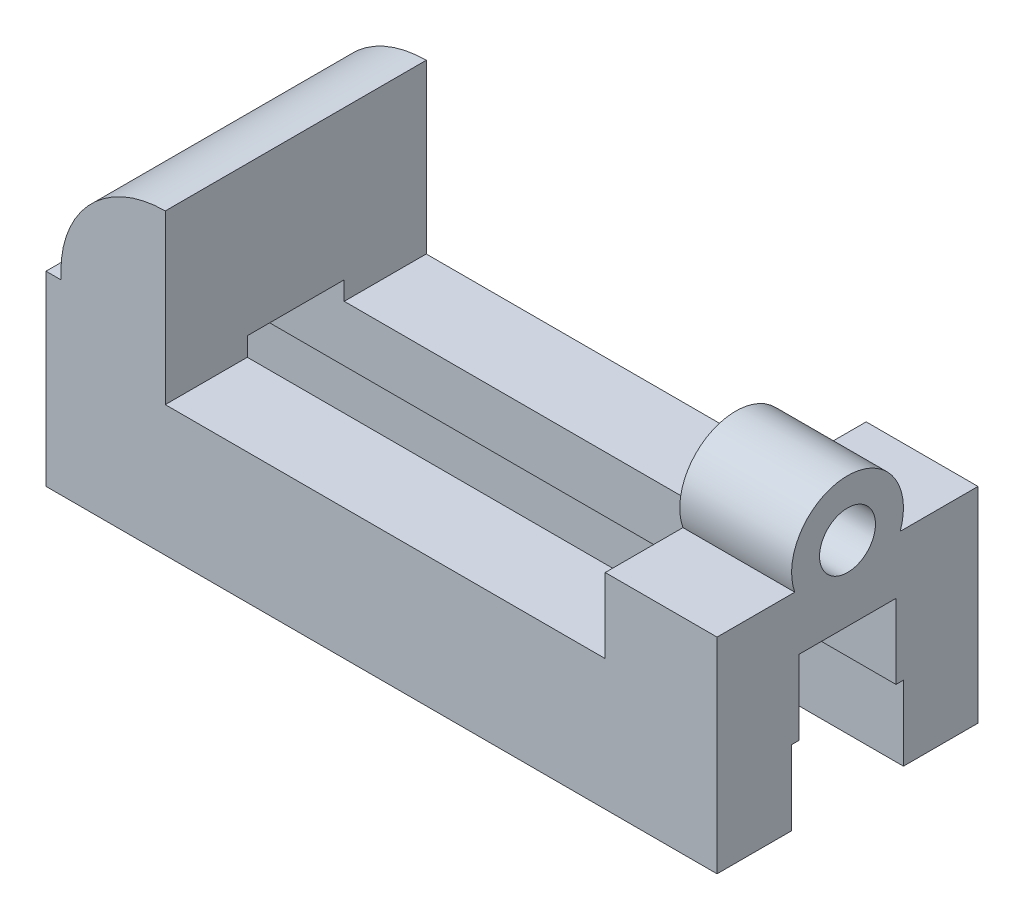
ISO-10303-21;
HEADER;
FILE_DESCRIPTION(('STEP AP214'),'2;1');
FILE_NAME('part.step','',(''),(''),'','','');
FILE_SCHEMA(('AUTOMOTIVE_DESIGN { 1 0 10303 214 1 1 1 1 }'));
ENDSEC;
DATA;
#1=APPLICATION_CONTEXT('core data for automotive mechanical design processes');
#2=APPLICATION_PROTOCOL_DEFINITION('international standard','automotive_design',2000,#1);
#3=PRODUCT_CONTEXT('',#1,'mechanical');
#4=PRODUCT('Part','Part','',(#3));
#5=PRODUCT_RELATED_PRODUCT_CATEGORY('part','',(#4));
#6=PRODUCT_DEFINITION_FORMATION('','',#4);
#7=PRODUCT_DEFINITION_CONTEXT('part definition',#1,'design');
#8=PRODUCT_DEFINITION('design','',#6,#7);
#9=PRODUCT_DEFINITION_SHAPE('','',#8);
#10=(LENGTH_UNIT() NAMED_UNIT(*) SI_UNIT(.MILLI.,.METRE.));
#11=(NAMED_UNIT(*) PLANE_ANGLE_UNIT() SI_UNIT($,.RADIAN.));
#12=(NAMED_UNIT(*) SI_UNIT($,.STERADIAN.) SOLID_ANGLE_UNIT());
#13=UNCERTAINTY_MEASURE_WITH_UNIT(LENGTH_MEASURE(1.E-05),#10,'distance_accuracy_value','');
#14=(GEOMETRIC_REPRESENTATION_CONTEXT(3) GLOBAL_UNCERTAINTY_ASSIGNED_CONTEXT((#13)) GLOBAL_UNIT_ASSIGNED_CONTEXT((#10,
#11,#12)) REPRESENTATION_CONTEXT('',''));
#15=CARTESIAN_POINT('',(0.,0.,0.));
#16=DIRECTION('',(0.,0.,1.));
#17=DIRECTION('',(1.,0.,0.));
#18=AXIS2_PLACEMENT_3D('',#15,#16,#17);
#19=CARTESIAN_POINT('',(180.,55.,-70.));
#20=DIRECTION('',(0.,1.,0.));
#21=DIRECTION('',(0.,0.,1.));
#22=AXIS2_PLACEMENT_3D('',#19,#20,#21);
#23=PLANE('',#22);
#24=DIRECTION('',(0.,0.,1.));
#25=VECTOR('',#24,1.);
#26=CARTESIAN_POINT('',(180.,55.,-70.));
#27=LINE('',#26,#25);
#28=CARTESIAN_POINT('',(180.,55.,-20.8578643762691));
#29=VERTEX_POINT('',#28);
#30=CARTESIAN_POINT('',(180.,55.,0.));
#31=VERTEX_POINT('',#30);
#32=EDGE_CURVE('E235',#29,#31,#27,.T.);
#33=ORIENTED_EDGE('',*,*,#32,.F.);
#34=DIRECTION('',(1.,0.,0.));
#35=VECTOR('',#34,1.);
#36=CARTESIAN_POINT('',(150.,55.,-20.8578643762691));
#37=LINE('',#36,#35);
#38=CARTESIAN_POINT('',(150.,55.,-20.8578643762691));
#39=VERTEX_POINT('',#38);
#40=EDGE_CURVE('E210',#29,#39,#37,.F.);
#41=ORIENTED_EDGE('',*,*,#40,.T.);
#42=DIRECTION('',(0.,0.,1.));
#43=VECTOR('',#42,1.);
#44=CARTESIAN_POINT('',(150.,55.,-70.));
#45=LINE('',#44,#43);
#46=CARTESIAN_POINT('',(150.,55.,0.));
#47=VERTEX_POINT('',#46);
#48=EDGE_CURVE('E220',#39,#47,#45,.T.);
#49=ORIENTED_EDGE('',*,*,#48,.T.);
#50=DIRECTION('',(-1.,0.,0.));
#51=VECTOR('',#50,1.);
#52=CARTESIAN_POINT('',(180.,55.,0.));
#53=LINE('',#52,#51);
#54=EDGE_CURVE('E356',#31,#47,#53,.T.);
#55=ORIENTED_EDGE('',*,*,#54,.F.);
#56=EDGE_LOOP('',(#33,#41,#49,#55));
#57=FACE_BOUND('',#56,.T.);
#58=ADVANCED_FACE('F38',(#57),#23,.T.);
#59=CARTESIAN_POINT('',(150.,55.,-70.));
#60=VERTEX_POINT('',#59);
#61=CARTESIAN_POINT('',(150.,55.,-49.1421356237309));
#62=VERTEX_POINT('',#61);
#63=EDGE_CURVE('E217',#60,#62,#45,.T.);
#64=ORIENTED_EDGE('',*,*,#63,.T.);
#65=DIRECTION('',(1.,0.,0.));
#66=VECTOR('',#65,1.);
#67=CARTESIAN_POINT('',(150.,55.,-49.1421356237309));
#68=LINE('',#67,#66);
#69=CARTESIAN_POINT('',(180.,55.,-49.1421356237309));
#70=VERTEX_POINT('',#69);
#71=EDGE_CURVE('E203',#62,#70,#68,.T.);
#72=ORIENTED_EDGE('',*,*,#71,.T.);
#73=CARTESIAN_POINT('',(180.,55.,-70.));
#74=VERTEX_POINT('',#73);
#75=EDGE_CURVE('E231',#74,#70,#27,.T.);
#76=ORIENTED_EDGE('',*,*,#75,.F.);
#77=DIRECTION('',(-1.,0.,0.));
#78=VECTOR('',#77,1.);
#79=CARTESIAN_POINT('',(180.,55.,-70.));
#80=LINE('',#79,#78);
#81=EDGE_CURVE('E226',#74,#60,#80,.T.);
#82=ORIENTED_EDGE('',*,*,#81,.T.);
#83=EDGE_LOOP('',(#64,#72,#76,#82));
#84=FACE_BOUND('',#83,.T.);
#85=ADVANCED_FACE('F224',(#84),#23,.T.);
#86=CARTESIAN_POINT('',(150.,35.,-70.));
#87=DIRECTION('',(0.,1.,0.));
#88=DIRECTION('',(-1.,0.,0.));
#89=AXIS2_PLACEMENT_3D('',#86,#87,#88);
#90=PLANE('',#89);
#91=DIRECTION('',(-1.,0.,0.));
#92=VECTOR('',#91,1.);
#93=CARTESIAN_POINT('',(150.,35.,-48.));
#94=LINE('',#93,#92);
#95=CARTESIAN_POINT('',(150.,35.,-48.));
#96=VERTEX_POINT('',#95);
#97=CARTESIAN_POINT('',(32.,35.,-48.));
#98=VERTEX_POINT('',#97);
#99=EDGE_CURVE('E312',#96,#98,#94,.T.);
#100=ORIENTED_EDGE('',*,*,#99,.F.);
#101=DIRECTION('',(0.,0.,1.));
#102=VECTOR('',#101,1.);
#103=CARTESIAN_POINT('',(150.,35.,-70.));
#104=LINE('',#103,#102);
#105=CARTESIAN_POINT('',(150.,35.,-70.));
#106=VERTEX_POINT('',#105);
#107=EDGE_CURVE('E229',#106,#96,#104,.T.);
#108=ORIENTED_EDGE('',*,*,#107,.F.);
#109=DIRECTION('',(-1.,0.,0.));
#110=VECTOR('',#109,1.);
#111=CARTESIAN_POINT('',(150.,35.,-70.));
#112=LINE('',#111,#110);
#113=CARTESIAN_POINT('',(32.,35.,-70.));
#114=VERTEX_POINT('',#113);
#115=EDGE_CURVE('E330',#106,#114,#112,.T.);
#116=ORIENTED_EDGE('',*,*,#115,.T.);
#117=DIRECTION('',(0.,0.,1.));
#118=VECTOR('',#117,1.);
#119=CARTESIAN_POINT('',(32.,35.,-70.));
#120=LINE('',#119,#118);
#121=EDGE_CURVE('E387',#114,#98,#120,.T.);
#122=ORIENTED_EDGE('',*,*,#121,.T.);
#123=EDGE_LOOP('',(#100,#108,#116,#122));
#124=FACE_BOUND('',#123,.T.);
#125=ADVANCED_FACE('F398',(#124),#90,.T.);
#126=CARTESIAN_POINT('',(0.,0.,-70.));
#127=DIRECTION('',(0.,-1.,0.));
#128=DIRECTION('',(0.,0.,-1.));
#129=AXIS2_PLACEMENT_3D('',#126,#127,#128);
#130=PLANE('',#129);
#131=DIRECTION('',(1.,0.,0.));
#132=VECTOR('',#131,1.);
#133=CARTESIAN_POINT('',(0.,0.,-50.));
#134=LINE('',#133,#132);
#135=CARTESIAN_POINT('',(0.,0.,-50.));
#136=VERTEX_POINT('',#135);
#137=CARTESIAN_POINT('',(180.,0.,-50.));
#138=VERTEX_POINT('',#137);
#139=EDGE_CURVE('E246',#136,#138,#134,.T.);
#140=ORIENTED_EDGE('',*,*,#139,.F.);
#141=DIRECTION('',(0.,0.,1.));
#142=VECTOR('',#141,1.);
#143=CARTESIAN_POINT('',(0.,0.,-70.));
#144=LINE('',#143,#142);
#145=CARTESIAN_POINT('',(0.,0.,-70.));
#146=VERTEX_POINT('',#145);
#147=EDGE_CURVE('E240',#146,#136,#144,.T.);
#148=ORIENTED_EDGE('',*,*,#147,.F.);
#149=DIRECTION('',(1.,0.,0.));
#150=VECTOR('',#149,1.);
#151=CARTESIAN_POINT('',(0.,0.,-70.));
#152=LINE('',#151,#150);
#153=CARTESIAN_POINT('',(180.,0.,-70.));
#154=VERTEX_POINT('',#153);
#155=EDGE_CURVE('E320',#146,#154,#152,.T.);
#156=ORIENTED_EDGE('',*,*,#155,.T.);
#157=DIRECTION('',(0.,0.,1.));
#158=VECTOR('',#157,1.);
#159=CARTESIAN_POINT('',(180.,0.,-70.));
#160=LINE('',#159,#158);
#161=EDGE_CURVE('E236',#154,#138,#160,.T.);
#162=ORIENTED_EDGE('',*,*,#161,.T.);
#163=EDGE_LOOP('',(#140,#148,#156,#162));
#164=FACE_BOUND('',#163,.T.);
#165=ADVANCED_FACE('F464',(#164),#130,.T.);
#166=CARTESIAN_POINT('',(0.,50.,-70.));
#167=DIRECTION('',(-1.,0.,0.));
#168=DIRECTION('',(0.,0.,1.));
#169=AXIS2_PLACEMENT_3D('',#166,#167,#168);
#170=PLANE('',#169);
#171=DIRECTION('',(0.,-1.,0.));
#172=VECTOR('',#171,1.);
#173=CARTESIAN_POINT('',(0.,0.,-50.));
#174=LINE('',#173,#172);
#175=CARTESIAN_POINT('',(0.,20.,-50.));
#176=VERTEX_POINT('',#175);
#177=EDGE_CURVE('E294',#176,#136,#174,.T.);
#178=ORIENTED_EDGE('',*,*,#177,.F.);
#179=DIRECTION('',(0.,0.,-1.));
#180=VECTOR('',#179,1.);
#181=CARTESIAN_POINT('',(0.,20.,-50.));
#182=LINE('',#181,#180);
#183=CARTESIAN_POINT('',(0.,20.,-48.));
#184=VERTEX_POINT('',#183);
#185=EDGE_CURVE('E423',#184,#176,#182,.T.);
#186=ORIENTED_EDGE('',*,*,#185,.F.);
#187=DIRECTION('',(0.,-1.,0.));
#188=VECTOR('',#187,1.);
#189=CARTESIAN_POINT('',(0.,20.,-48.));
#190=LINE('',#189,#188);
#191=CARTESIAN_POINT('',(0.,40.,-48.));
#192=VERTEX_POINT('',#191);
#193=EDGE_CURVE('E426',#192,#184,#190,.T.);
#194=ORIENTED_EDGE('',*,*,#193,.F.);
#195=DIRECTION('',(0.,0.,-1.));
#196=VECTOR('',#195,1.);
#197=CARTESIAN_POINT('',(0.,40.,-48.));
#198=LINE('',#197,#196);
#199=CARTESIAN_POINT('',(0.,40.,-22.));
#200=VERTEX_POINT('',#199);
#201=EDGE_CURVE('E417',#200,#192,#198,.T.);
#202=ORIENTED_EDGE('',*,*,#201,.F.);
#203=DIRECTION('',(0.,1.,0.));
#204=VECTOR('',#203,1.);
#205=CARTESIAN_POINT('',(0.,40.,-22.));
#206=LINE('',#205,#204);
#207=CARTESIAN_POINT('',(0.,20.,-22.));
#208=VERTEX_POINT('',#207);
#209=EDGE_CURVE('E429',#208,#200,#206,.T.);
#210=ORIENTED_EDGE('',*,*,#209,.F.);
#211=DIRECTION('',(0.,0.,-1.));
#212=VECTOR('',#211,1.);
#213=CARTESIAN_POINT('',(0.,20.,-22.));
#214=LINE('',#213,#212);
#215=CARTESIAN_POINT('',(0.,20.,-20.));
#216=VERTEX_POINT('',#215);
#217=EDGE_CURVE('E288',#216,#208,#214,.T.);
#218=ORIENTED_EDGE('',*,*,#217,.F.);
#219=DIRECTION('',(0.,1.,0.));
#220=VECTOR('',#219,1.);
#221=CARTESIAN_POINT('',(0.,20.,-20.));
#222=LINE('',#221,#220);
#223=CARTESIAN_POINT('',(0.,0.,-20.));
#224=VERTEX_POINT('',#223);
#225=EDGE_CURVE('E432',#224,#216,#222,.T.);
#226=ORIENTED_EDGE('',*,*,#225,.F.);
#227=CARTESIAN_POINT('',(0.,0.,0.));
#228=VERTEX_POINT('',#227);
#229=EDGE_CURVE('E243',#224,#228,#144,.T.);
#230=ORIENTED_EDGE('',*,*,#229,.T.);
#231=DIRECTION('',(0.,-1.,0.));
#232=VECTOR('',#231,1.);
#233=CARTESIAN_POINT('',(0.,50.,0.));
#234=LINE('',#233,#232);
#235=CARTESIAN_POINT('',(0.,50.,0.));
#236=VERTEX_POINT('',#235);
#237=EDGE_CURVE('E316',#236,#228,#234,.T.);
#238=ORIENTED_EDGE('',*,*,#237,.F.);
#239=DIRECTION('',(0.,0.,1.));
#240=VECTOR('',#239,1.);
#241=CARTESIAN_POINT('',(0.,50.,-70.));
#242=LINE('',#241,#240);
#243=CARTESIAN_POINT('',(0.,50.,-70.));
#244=VERTEX_POINT('',#243);
#245=EDGE_CURVE('E247',#244,#236,#242,.T.);
#246=ORIENTED_EDGE('',*,*,#245,.F.);
#247=DIRECTION('',(0.,-1.,0.));
#248=VECTOR('',#247,1.);
#249=CARTESIAN_POINT('',(0.,50.,-70.));
#250=LINE('',#249,#248);
#251=EDGE_CURVE('E317',#244,#146,#250,.T.);
#252=ORIENTED_EDGE('',*,*,#251,.T.);
#253=ORIENTED_EDGE('',*,*,#147,.T.);
#254=EDGE_LOOP('',(#178,#186,#194,#202,#210,#218,#226,#230,#238,#246,#252,#253));
#255=FACE_BOUND('',#254,.T.);
#256=ADVANCED_FACE('F40',(#255),#170,.T.);
#257=CARTESIAN_POINT('',(4.,50.,-70.));
#258=DIRECTION('',(0.,1.,0.));
#259=DIRECTION('',(-1.,0.,0.));
#260=AXIS2_PLACEMENT_3D('',#257,#258,#259);
#261=PLANE('',#260);
#262=DIRECTION('',(-1.,0.,0.));
#263=VECTOR('',#262,1.);
#264=CARTESIAN_POINT('',(4.,50.,0.));
#265=LINE('',#264,#263);
#266=CARTESIAN_POINT('',(4.,50.,0.));
#267=VERTEX_POINT('',#266);
#268=EDGE_CURVE('E321',#267,#236,#265,.T.);
#269=ORIENTED_EDGE('',*,*,#268,.F.);
#270=DIRECTION('',(0.,0.,1.));
#271=VECTOR('',#270,1.);
#272=CARTESIAN_POINT('',(4.,50.,-70.));
#273=LINE('',#272,#271);
#274=CARTESIAN_POINT('',(4.,50.,-70.));
#275=VERTEX_POINT('',#274);
#276=EDGE_CURVE('E380',#275,#267,#273,.T.);
#277=ORIENTED_EDGE('',*,*,#276,.F.);
#278=DIRECTION('',(-1.,0.,0.));
#279=VECTOR('',#278,1.);
#280=CARTESIAN_POINT('',(4.,50.,-70.));
#281=LINE('',#280,#279);
#282=EDGE_CURVE('E345',#275,#244,#281,.T.);
#283=ORIENTED_EDGE('',*,*,#282,.T.);
#284=ORIENTED_EDGE('',*,*,#245,.T.);
#285=EDGE_LOOP('',(#269,#277,#283,#284));
#286=FACE_BOUND('',#285,.T.);
#287=ADVANCED_FACE('F477',(#286),#261,.T.);
#288=CARTESIAN_POINT('',(4.,52.0000999999998,-70.));
#289=DIRECTION('',(-1.,0.,0.));
#290=DIRECTION('',(0.,-1.,0.));
#291=AXIS2_PLACEMENT_3D('',#288,#289,#290);
#292=PLANE('',#291);
#293=DIRECTION('',(0.,-1.,0.));
#294=VECTOR('',#293,1.);
#295=CARTESIAN_POINT('',(4.,52.0000999999998,0.));
#296=LINE('',#295,#294);
#297=CARTESIAN_POINT('',(4.,52.0000999999998,0.));
#298=VERTEX_POINT('',#297);
#299=EDGE_CURVE('E374',#298,#267,#296,.T.);
#300=ORIENTED_EDGE('',*,*,#299,.F.);
#301=DIRECTION('',(0.,0.,1.));
#302=VECTOR('',#301,1.);
#303=CARTESIAN_POINT('',(4.,52.0000999999998,-70.));
#304=LINE('',#303,#302);
#305=CARTESIAN_POINT('',(4.,52.0000999999998,-70.));
#306=VERTEX_POINT('',#305);
#307=EDGE_CURVE('E382',#306,#298,#304,.T.);
#308=ORIENTED_EDGE('',*,*,#307,.F.);
#309=DIRECTION('',(0.,-1.,0.));
#310=VECTOR('',#309,1.);
#311=CARTESIAN_POINT('',(4.,52.0000999999998,-70.));
#312=LINE('',#311,#310);
#313=EDGE_CURVE('E342',#306,#275,#312,.T.);
#314=ORIENTED_EDGE('',*,*,#313,.T.);
#315=ORIENTED_EDGE('',*,*,#276,.T.);
#316=EDGE_LOOP('',(#300,#308,#314,#315));
#317=FACE_BOUND('',#316,.T.);
#318=ADVANCED_FACE('F493',(#317),#292,.T.);
#319=CARTESIAN_POINT('',(31.9999,52.0001,-70.));
#320=DIRECTION('',(0.,0.,1.));
#321=DIRECTION('',(1.,0.,0.));
#322=AXIS2_PLACEMENT_3D('',#319,#320,#321);
#323=CYLINDRICAL_SURFACE('',#322,27.9999);
#324=CARTESIAN_POINT('',(31.9999,52.0001,0.));
#325=DIRECTION('',(0.,0.,1.));
#326=DIRECTION('',(1.,0.,0.));
#327=AXIS2_PLACEMENT_3D('',#324,#325,#326);
#328=CIRCLE('',#327,27.9999);
#329=CARTESIAN_POINT('',(31.9999000000002,80.,0.));
#330=VERTEX_POINT('',#329);
#331=EDGE_CURVE('E371',#330,#298,#328,.T.);
#332=ORIENTED_EDGE('',*,*,#331,.F.);
#333=DIRECTION('',(0.,0.,1.));
#334=VECTOR('',#333,1.);
#335=CARTESIAN_POINT('',(31.9999000000002,80.,-70.));
#336=LINE('',#335,#334);
#337=CARTESIAN_POINT('',(31.9999000000002,80.,-70.));
#338=VERTEX_POINT('',#337);
#339=EDGE_CURVE('E384',#338,#330,#336,.T.);
#340=ORIENTED_EDGE('',*,*,#339,.F.);
#341=CARTESIAN_POINT('',(31.9999,52.0001,-70.));
#342=DIRECTION('',(0.,0.,1.));
#343=DIRECTION('',(1.,0.,0.));
#344=AXIS2_PLACEMENT_3D('',#341,#342,#343);
#345=CIRCLE('',#344,27.9999);
#346=EDGE_CURVE('E339',#338,#306,#345,.T.);
#347=ORIENTED_EDGE('',*,*,#346,.T.);
#348=ORIENTED_EDGE('',*,*,#307,.T.);
#349=EDGE_LOOP('',(#332,#340,#347,#348));
#350=FACE_BOUND('',#349,.T.);
#351=ADVANCED_FACE('F496',(#350),#323,.T.);
#352=CARTESIAN_POINT('',(32.,80.,-70.));
#353=DIRECTION('',(0.,1.,0.));
#354=DIRECTION('',(0.,0.,1.));
#355=AXIS2_PLACEMENT_3D('',#352,#353,#354);
#356=PLANE('',#355);
#357=DIRECTION('',(-1.,0.,0.));
#358=VECTOR('',#357,1.);
#359=CARTESIAN_POINT('',(32.,80.,0.));
#360=LINE('',#359,#358);
#361=CARTESIAN_POINT('',(32.,80.,0.));
#362=VERTEX_POINT('',#361);
#363=EDGE_CURVE('E368',#362,#330,#360,.T.);
#364=ORIENTED_EDGE('',*,*,#363,.F.);
#365=DIRECTION('',(0.,0.,1.));
#366=VECTOR('',#365,1.);
#367=CARTESIAN_POINT('',(32.,80.,-70.));
#368=LINE('',#367,#366);
#369=CARTESIAN_POINT('',(32.,80.,-70.));
#370=VERTEX_POINT('',#369);
#371=EDGE_CURVE('E386',#370,#362,#368,.T.);
#372=ORIENTED_EDGE('',*,*,#371,.F.);
#373=DIRECTION('',(-1.,0.,0.));
#374=VECTOR('',#373,1.);
#375=CARTESIAN_POINT('',(32.,80.,-70.));
#376=LINE('',#375,#374);
#377=EDGE_CURVE('E336',#370,#338,#376,.T.);
#378=ORIENTED_EDGE('',*,*,#377,.T.);
#379=ORIENTED_EDGE('',*,*,#339,.T.);
#380=EDGE_LOOP('',(#364,#372,#378,#379));
#381=FACE_BOUND('',#380,.T.);
#382=ADVANCED_FACE('F498',(#381),#356,.T.);
#383=CARTESIAN_POINT('',(32.,35.,-70.));
#384=DIRECTION('',(1.,0.,0.));
#385=DIRECTION('',(0.,0.,-1.));
#386=AXIS2_PLACEMENT_3D('',#383,#384,#385);
#387=PLANE('',#386);
#388=DIRECTION('',(0.,1.,0.));
#389=VECTOR('',#388,1.);
#390=CARTESIAN_POINT('',(32.,35.,-48.));
#391=LINE('',#390,#389);
#392=CARTESIAN_POINT('',(32.,40.,-48.));
#393=VERTEX_POINT('',#392);
#394=EDGE_CURVE('E314',#98,#393,#391,.T.);
#395=ORIENTED_EDGE('',*,*,#394,.F.);
#396=ORIENTED_EDGE('',*,*,#121,.F.);
#397=DIRECTION('',(0.,1.,0.));
#398=VECTOR('',#397,1.);
#399=CARTESIAN_POINT('',(32.,35.,-70.));
#400=LINE('',#399,#398);
#401=EDGE_CURVE('E333',#114,#370,#400,.T.);
#402=ORIENTED_EDGE('',*,*,#401,.T.);
#403=ORIENTED_EDGE('',*,*,#371,.T.);
#404=DIRECTION('',(0.,1.,0.));
#405=VECTOR('',#404,1.);
#406=CARTESIAN_POINT('',(32.,35.,0.));
#407=LINE('',#406,#405);
#408=CARTESIAN_POINT('',(32.,35.,0.));
#409=VERTEX_POINT('',#408);
#410=EDGE_CURVE('E365',#409,#362,#407,.T.);
#411=ORIENTED_EDGE('',*,*,#410,.F.);
#412=CARTESIAN_POINT('',(32.,35.,-22.));
#413=VERTEX_POINT('',#412);
#414=EDGE_CURVE('E389',#413,#409,#120,.T.);
#415=ORIENTED_EDGE('',*,*,#414,.F.);
#416=DIRECTION('',(0.,-1.,0.));
#417=VECTOR('',#416,1.);
#418=CARTESIAN_POINT('',(32.,35.,-22.));
#419=LINE('',#418,#417);
#420=CARTESIAN_POINT('',(32.,40.,-22.));
#421=VERTEX_POINT('',#420);
#422=EDGE_CURVE('E305',#421,#413,#419,.T.);
#423=ORIENTED_EDGE('',*,*,#422,.F.);
#424=DIRECTION('',(0.,0.,1.));
#425=VECTOR('',#424,1.);
#426=CARTESIAN_POINT('',(32.,40.,-70.));
#427=LINE('',#426,#425);
#428=EDGE_CURVE('E308',#393,#421,#427,.T.);
#429=ORIENTED_EDGE('',*,*,#428,.F.);
#430=EDGE_LOOP('',(#395,#396,#402,#403,#411,#415,#423,#429));
#431=FACE_BOUND('',#430,.T.);
#432=ADVANCED_FACE('F407',(#431),#387,.T.);
#433=DIRECTION('',(1.,0.,0.));
#434=VECTOR('',#433,1.);
#435=CARTESIAN_POINT('',(150.,35.,-22.));
#436=LINE('',#435,#434);
#437=CARTESIAN_POINT('',(150.,35.,-22.));
#438=VERTEX_POINT('',#437);
#439=EDGE_CURVE('E61',#413,#438,#436,.T.);
#440=ORIENTED_EDGE('',*,*,#439,.F.);
#441=ORIENTED_EDGE('',*,*,#414,.T.);
#442=DIRECTION('',(-1.,0.,0.));
#443=VECTOR('',#442,1.);
#444=CARTESIAN_POINT('',(150.,35.,0.));
#445=LINE('',#444,#443);
#446=CARTESIAN_POINT('',(150.,35.,0.));
#447=VERTEX_POINT('',#446);
#448=EDGE_CURVE('E362',#447,#409,#445,.T.);
#449=ORIENTED_EDGE('',*,*,#448,.F.);
#450=EDGE_CURVE('E227',#438,#447,#104,.T.);
#451=ORIENTED_EDGE('',*,*,#450,.F.);
#452=EDGE_LOOP('',(#440,#441,#449,#451));
#453=FACE_BOUND('',#452,.T.);
#454=ADVANCED_FACE('F445',(#453),#90,.T.);
#455=CARTESIAN_POINT('',(150.,55.,-70.));
#456=DIRECTION('',(-1.,0.,0.));
#457=DIRECTION('',(0.,0.,1.));
#458=AXIS2_PLACEMENT_3D('',#455,#456,#457);
#459=PLANE('',#458);
#460=ORIENTED_EDGE('',*,*,#48,.F.);
#461=CARTESIAN_POINT('',(150.,60.,-35.));
#462=DIRECTION('',(-1.,0.,0.));
#463=DIRECTION('',(0.,0.,1.));
#464=AXIS2_PLACEMENT_3D('',#461,#462,#463);
#465=CIRCLE('',#464,15.);
#466=EDGE_CURVE('E206',#39,#62,#465,.T.);
#467=ORIENTED_EDGE('',*,*,#466,.T.);
#468=ORIENTED_EDGE('',*,*,#63,.F.);
#469=DIRECTION('',(0.,-1.,0.));
#470=VECTOR('',#469,1.);
#471=CARTESIAN_POINT('',(150.,55.,-70.));
#472=LINE('',#471,#470);
#473=EDGE_CURVE('E328',#60,#106,#472,.T.);
#474=ORIENTED_EDGE('',*,*,#473,.T.);
#475=ORIENTED_EDGE('',*,*,#107,.T.);
#476=DIRECTION('',(0.,-1.,0.));
#477=VECTOR('',#476,1.);
#478=CARTESIAN_POINT('',(150.,55.,-48.));
#479=LINE('',#478,#477);
#480=CARTESIAN_POINT('',(150.,40.,-48.));
#481=VERTEX_POINT('',#480);
#482=EDGE_CURVE('E310',#481,#96,#479,.T.);
#483=ORIENTED_EDGE('',*,*,#482,.F.);
#484=DIRECTION('',(0.,0.,-1.));
#485=VECTOR('',#484,1.);
#486=CARTESIAN_POINT('',(150.,40.,-70.));
#487=LINE('',#486,#485);
#488=CARTESIAN_POINT('',(150.,40.,-22.));
#489=VERTEX_POINT('',#488);
#490=EDGE_CURVE('E271',#489,#481,#487,.T.);
#491=ORIENTED_EDGE('',*,*,#490,.F.);
#492=DIRECTION('',(0.,1.,0.));
#493=VECTOR('',#492,1.);
#494=CARTESIAN_POINT('',(150.,55.,-22.));
#495=LINE('',#494,#493);
#496=EDGE_CURVE('E302',#438,#489,#495,.T.);
#497=ORIENTED_EDGE('',*,*,#496,.F.);
#498=ORIENTED_EDGE('',*,*,#450,.T.);
#499=DIRECTION('',(0.,-1.,0.));
#500=VECTOR('',#499,1.);
#501=CARTESIAN_POINT('',(150.,55.,0.));
#502=LINE('',#501,#500);
#503=EDGE_CURVE('E359',#47,#447,#502,.T.);
#504=ORIENTED_EDGE('',*,*,#503,.F.);
#505=EDGE_LOOP('',(#460,#467,#468,#474,#475,#483,#491,#497,#498,#504));
#506=FACE_BOUND('',#505,.T.);
#507=CARTESIAN_POINT('',(150.,60.,-35.));
#508=DIRECTION('',(-1.,0.,0.));
#509=DIRECTION('',(0.,0.,1.));
#510=AXIS2_PLACEMENT_3D('',#507,#508,#509);
#511=CIRCLE('',#510,7.5);
#512=CARTESIAN_POINT('',(150.,60.,-27.5));
#513=VERTEX_POINT('',#512);
#514=EDGE_CURVE('E221',#513,#513,#511,.T.);
#515=ORIENTED_EDGE('',*,*,#514,.F.);
#516=EDGE_LOOP('',(#515));
#517=FACE_BOUND('',#516,.T.);
#518=ADVANCED_FACE('F214',(#506,#517),#459,.T.);
#519=CARTESIAN_POINT('',(180.,0.,-70.));
#520=DIRECTION('',(1.,0.,0.));
#521=DIRECTION('',(0.,0.,-1.));
#522=AXIS2_PLACEMENT_3D('',#519,#520,#521);
#523=PLANE('',#522);
#524=CARTESIAN_POINT('',(180.,60.,-35.));
#525=DIRECTION('',(-1.,0.,0.));
#526=DIRECTION('',(0.,0.,1.));
#527=AXIS2_PLACEMENT_3D('',#524,#525,#526);
#528=CIRCLE('',#527,7.5);
#529=CARTESIAN_POINT('',(180.,60.,-27.5));
#530=VERTEX_POINT('',#529);
#531=EDGE_CURVE('E437',#530,#530,#528,.T.);
#532=ORIENTED_EDGE('',*,*,#531,.T.);
#533=EDGE_LOOP('',(#532));
#534=FACE_BOUND('',#533,.T.);
#535=ORIENTED_EDGE('',*,*,#75,.T.);
#536=CARTESIAN_POINT('',(180.,60.,-35.));
#537=DIRECTION('',(-1.,0.,0.));
#538=DIRECTION('',(0.,0.,1.));
#539=AXIS2_PLACEMENT_3D('',#536,#537,#538);
#540=CIRCLE('',#539,15.);
#541=EDGE_CURVE('E53',#29,#70,#540,.T.);
#542=ORIENTED_EDGE('',*,*,#541,.F.);
#543=ORIENTED_EDGE('',*,*,#32,.T.);
#544=DIRECTION('',(0.,1.,0.));
#545=VECTOR('',#544,1.);
#546=CARTESIAN_POINT('',(180.,0.,0.));
#547=LINE('',#546,#545);
#548=CARTESIAN_POINT('',(180.,0.,0.));
#549=VERTEX_POINT('',#548);
#550=EDGE_CURVE('E353',#549,#31,#547,.T.);
#551=ORIENTED_EDGE('',*,*,#550,.F.);
#552=CARTESIAN_POINT('',(180.,0.,-20.));
#553=VERTEX_POINT('',#552);
#554=EDGE_CURVE('E239',#553,#549,#160,.T.);
#555=ORIENTED_EDGE('',*,*,#554,.F.);
#556=DIRECTION('',(0.,-1.,0.));
#557=VECTOR('',#556,1.);
#558=CARTESIAN_POINT('',(180.,0.,-20.));
#559=LINE('',#558,#557);
#560=CARTESIAN_POINT('',(180.,20.,-20.));
#561=VERTEX_POINT('',#560);
#562=EDGE_CURVE('E297',#561,#553,#559,.T.);
#563=ORIENTED_EDGE('',*,*,#562,.F.);
#564=DIRECTION('',(0.,0.,1.));
#565=VECTOR('',#564,1.);
#566=CARTESIAN_POINT('',(180.,20.,-70.));
#567=LINE('',#566,#565);
#568=CARTESIAN_POINT('',(180.,20.,-22.));
#569=VERTEX_POINT('',#568);
#570=EDGE_CURVE('E249',#569,#561,#567,.T.);
#571=ORIENTED_EDGE('',*,*,#570,.F.);
#572=DIRECTION('',(0.,-1.,0.));
#573=VECTOR('',#572,1.);
#574=CARTESIAN_POINT('',(180.,0.,-22.));
#575=LINE('',#574,#573);
#576=CARTESIAN_POINT('',(180.,40.,-22.));
#577=VERTEX_POINT('',#576);
#578=EDGE_CURVE('E251',#577,#569,#575,.T.);
#579=ORIENTED_EDGE('',*,*,#578,.F.);
#580=DIRECTION('',(0.,0.,1.));
#581=VECTOR('',#580,1.);
#582=CARTESIAN_POINT('',(180.,40.,-70.));
#583=LINE('',#582,#581);
#584=CARTESIAN_POINT('',(180.,40.,-48.));
#585=VERTEX_POINT('',#584);
#586=EDGE_CURVE('E253',#585,#577,#583,.T.);
#587=ORIENTED_EDGE('',*,*,#586,.F.);
#588=DIRECTION('',(0.,1.,0.));
#589=VECTOR('',#588,1.);
#590=CARTESIAN_POINT('',(180.,0.,-48.));
#591=LINE('',#590,#589);
#592=CARTESIAN_POINT('',(180.,20.,-48.));
#593=VERTEX_POINT('',#592);
#594=EDGE_CURVE('E46',#593,#585,#591,.T.);
#595=ORIENTED_EDGE('',*,*,#594,.F.);
#596=DIRECTION('',(0.,0.,1.));
#597=VECTOR('',#596,1.);
#598=CARTESIAN_POINT('',(180.,20.,-70.));
#599=LINE('',#598,#597);
#600=CARTESIAN_POINT('',(180.,20.,-50.));
#601=VERTEX_POINT('',#600);
#602=EDGE_CURVE('E11',#601,#593,#599,.T.);
#603=ORIENTED_EDGE('',*,*,#602,.F.);
#604=DIRECTION('',(0.,1.,0.));
#605=VECTOR('',#604,1.);
#606=CARTESIAN_POINT('',(180.,0.,-50.));
#607=LINE('',#606,#605);
#608=EDGE_CURVE('E299',#138,#601,#607,.T.);
#609=ORIENTED_EDGE('',*,*,#608,.F.);
#610=ORIENTED_EDGE('',*,*,#161,.F.);
#611=DIRECTION('',(0.,1.,0.));
#612=VECTOR('',#611,1.);
#613=CARTESIAN_POINT('',(180.,0.,-70.));
#614=LINE('',#613,#612);
#615=EDGE_CURVE('E324',#154,#74,#614,.T.);
#616=ORIENTED_EDGE('',*,*,#615,.T.);
#617=EDGE_LOOP('',(#535,#542,#543,#551,#555,#563,#571,#579,#587,#595,#603,#609,#610,#616));
#618=FACE_BOUND('',#617,.T.);
#619=ADVANCED_FACE('F275',(#534,#618),#523,.T.);
#620=DIRECTION('',(-1.,0.,0.));
#621=VECTOR('',#620,1.);
#622=CARTESIAN_POINT('',(0.,0.,-20.));
#623=LINE('',#622,#621);
#624=EDGE_CURVE('E244',#553,#224,#623,.T.);
#625=ORIENTED_EDGE('',*,*,#624,.F.);
#626=ORIENTED_EDGE('',*,*,#554,.T.);
#627=DIRECTION('',(1.,0.,0.));
#628=VECTOR('',#627,1.);
#629=CARTESIAN_POINT('',(0.,0.,0.));
#630=LINE('',#629,#628);
#631=EDGE_CURVE('E350',#228,#549,#630,.T.);
#632=ORIENTED_EDGE('',*,*,#631,.F.);
#633=ORIENTED_EDGE('',*,*,#229,.F.);
#634=EDGE_LOOP('',(#625,#626,#632,#633));
#635=FACE_BOUND('',#634,.T.);
#636=ADVANCED_FACE('F451',(#635),#130,.T.);
#637=CARTESIAN_POINT('',(31.9999,52.0001,-70.));
#638=DIRECTION('',(0.,0.,1.));
#639=DIRECTION('',(1.,0.,0.));
#640=AXIS2_PLACEMENT_3D('',#637,#638,#639);
#641=PLANE('',#640);
#642=ORIENTED_EDGE('',*,*,#251,.F.);
#643=ORIENTED_EDGE('',*,*,#282,.F.);
#644=ORIENTED_EDGE('',*,*,#313,.F.);
#645=ORIENTED_EDGE('',*,*,#346,.F.);
#646=ORIENTED_EDGE('',*,*,#377,.F.);
#647=ORIENTED_EDGE('',*,*,#401,.F.);
#648=ORIENTED_EDGE('',*,*,#115,.F.);
#649=ORIENTED_EDGE('',*,*,#473,.F.);
#650=ORIENTED_EDGE('',*,*,#81,.F.);
#651=ORIENTED_EDGE('',*,*,#615,.F.);
#652=ORIENTED_EDGE('',*,*,#155,.F.);
#653=EDGE_LOOP('',(#642,#643,#644,#645,#646,#647,#648,#649,#650,#651,#652));
#654=FACE_BOUND('',#653,.T.);
#655=ADVANCED_FACE('F402',(#654),#641,.F.);
#656=CARTESIAN_POINT('',(31.9999,52.0001,0.));
#657=DIRECTION('',(0.,0.,1.));
#658=DIRECTION('',(1.,0.,0.));
#659=AXIS2_PLACEMENT_3D('',#656,#657,#658);
#660=PLANE('',#659);
#661=ORIENTED_EDGE('',*,*,#237,.T.);
#662=ORIENTED_EDGE('',*,*,#631,.T.);
#663=ORIENTED_EDGE('',*,*,#550,.T.);
#664=ORIENTED_EDGE('',*,*,#54,.T.);
#665=ORIENTED_EDGE('',*,*,#503,.T.);
#666=ORIENTED_EDGE('',*,*,#448,.T.);
#667=ORIENTED_EDGE('',*,*,#410,.T.);
#668=ORIENTED_EDGE('',*,*,#363,.T.);
#669=ORIENTED_EDGE('',*,*,#331,.T.);
#670=ORIENTED_EDGE('',*,*,#299,.T.);
#671=ORIENTED_EDGE('',*,*,#268,.T.);
#672=EDGE_LOOP('',(#661,#662,#663,#664,#665,#666,#667,#668,#669,#670,#671));
#673=FACE_BOUND('',#672,.T.);
#674=ADVANCED_FACE('F468',(#673),#660,.T.);
#675=CARTESIAN_POINT('',(196.,40.,-48.));
#676=DIRECTION('',(0.,1.,0.));
#677=DIRECTION('',(0.,0.,1.));
#678=AXIS2_PLACEMENT_3D('',#675,#676,#677);
#679=PLANE('',#678);
#680=ORIENTED_EDGE('',*,*,#428,.T.);
#681=DIRECTION('',(-1.,0.,0.));
#682=VECTOR('',#681,1.);
#683=CARTESIAN_POINT('',(196.,40.,-22.));
#684=LINE('',#683,#682);
#685=EDGE_CURVE('E290',#421,#200,#684,.T.);
#686=ORIENTED_EDGE('',*,*,#685,.T.);
#687=ORIENTED_EDGE('',*,*,#201,.T.);
#688=DIRECTION('',(-1.,0.,0.));
#689=VECTOR('',#688,1.);
#690=CARTESIAN_POINT('',(196.,40.,-48.));
#691=LINE('',#690,#689);
#692=EDGE_CURVE('E272',#393,#192,#691,.T.);
#693=ORIENTED_EDGE('',*,*,#692,.F.);
#694=EDGE_LOOP('',(#680,#686,#687,#693));
#695=FACE_BOUND('',#694,.T.);
#696=ADVANCED_FACE('F414',(#695),#679,.F.);
#697=CARTESIAN_POINT('',(196.,0.,-50.));
#698=DIRECTION('',(0.,0.,-1.));
#699=DIRECTION('',(-1.,0.,0.));
#700=AXIS2_PLACEMENT_3D('',#697,#698,#699);
#701=PLANE('',#700);
#702=ORIENTED_EDGE('',*,*,#608,.T.);
#703=DIRECTION('',(-1.,0.,0.));
#704=VECTOR('',#703,1.);
#705=CARTESIAN_POINT('',(196.,20.,-50.));
#706=LINE('',#705,#704);
#707=EDGE_CURVE('E300',#601,#176,#706,.T.);
#708=ORIENTED_EDGE('',*,*,#707,.T.);
#709=ORIENTED_EDGE('',*,*,#177,.T.);
#710=ORIENTED_EDGE('',*,*,#139,.T.);
#711=EDGE_LOOP('',(#702,#708,#709,#710));
#712=FACE_BOUND('',#711,.T.);
#713=ADVANCED_FACE('F512',(#712),#701,.F.);
#714=CARTESIAN_POINT('',(196.,20.,-50.));
#715=DIRECTION('',(0.,1.,0.));
#716=DIRECTION('',(0.,0.,1.));
#717=AXIS2_PLACEMENT_3D('',#714,#715,#716);
#718=PLANE('',#717);
#719=ORIENTED_EDGE('',*,*,#602,.T.);
#720=DIRECTION('',(-1.,0.,0.));
#721=VECTOR('',#720,1.);
#722=CARTESIAN_POINT('',(196.,20.,-48.));
#723=LINE('',#722,#721);
#724=EDGE_CURVE('E263',#593,#184,#723,.T.);
#725=ORIENTED_EDGE('',*,*,#724,.T.);
#726=ORIENTED_EDGE('',*,*,#185,.T.);
#727=ORIENTED_EDGE('',*,*,#707,.F.);
#728=EDGE_LOOP('',(#719,#725,#726,#727));
#729=FACE_BOUND('',#728,.T.);
#730=ADVANCED_FACE('F511',(#729),#718,.F.);
#731=CARTESIAN_POINT('',(196.,20.,-48.));
#732=DIRECTION('',(0.,0.,-1.));
#733=DIRECTION('',(-1.,0.,0.));
#734=AXIS2_PLACEMENT_3D('',#731,#732,#733);
#735=PLANE('',#734);
#736=ORIENTED_EDGE('',*,*,#394,.T.);
#737=ORIENTED_EDGE('',*,*,#692,.T.);
#738=ORIENTED_EDGE('',*,*,#193,.T.);
#739=ORIENTED_EDGE('',*,*,#724,.F.);
#740=ORIENTED_EDGE('',*,*,#594,.T.);
#741=EDGE_CURVE('E260',#585,#481,#691,.T.);
#742=ORIENTED_EDGE('',*,*,#741,.T.);
#743=ORIENTED_EDGE('',*,*,#482,.T.);
#744=ORIENTED_EDGE('',*,*,#99,.T.);
#745=EDGE_LOOP('',(#736,#737,#738,#739,#740,#742,#743,#744));
#746=FACE_BOUND('',#745,.T.);
#747=ADVANCED_FACE('F259',(#746),#735,.F.);
#748=ORIENTED_EDGE('',*,*,#490,.T.);
#749=ORIENTED_EDGE('',*,*,#741,.F.);
#750=ORIENTED_EDGE('',*,*,#586,.T.);
#751=EDGE_CURVE('E283',#577,#489,#684,.T.);
#752=ORIENTED_EDGE('',*,*,#751,.T.);
#753=EDGE_LOOP('',(#748,#749,#750,#752));
#754=FACE_BOUND('',#753,.T.);
#755=ADVANCED_FACE('F267',(#754),#679,.F.);
#756=CARTESIAN_POINT('',(196.,40.,-22.));
#757=DIRECTION('',(0.,0.,1.));
#758=DIRECTION('',(1.,0.,0.));
#759=AXIS2_PLACEMENT_3D('',#756,#757,#758);
#760=PLANE('',#759);
#761=ORIENTED_EDGE('',*,*,#422,.T.);
#762=ORIENTED_EDGE('',*,*,#439,.T.);
#763=ORIENTED_EDGE('',*,*,#496,.T.);
#764=ORIENTED_EDGE('',*,*,#751,.F.);
#765=ORIENTED_EDGE('',*,*,#578,.T.);
#766=DIRECTION('',(-1.,0.,0.));
#767=VECTOR('',#766,1.);
#768=CARTESIAN_POINT('',(196.,20.,-22.));
#769=LINE('',#768,#767);
#770=EDGE_CURVE('E281',#569,#208,#769,.T.);
#771=ORIENTED_EDGE('',*,*,#770,.T.);
#772=ORIENTED_EDGE('',*,*,#209,.T.);
#773=ORIENTED_EDGE('',*,*,#685,.F.);
#774=EDGE_LOOP('',(#761,#762,#763,#764,#765,#771,#772,#773));
#775=FACE_BOUND('',#774,.T.);
#776=ADVANCED_FACE('F279',(#775),#760,.F.);
#777=CARTESIAN_POINT('',(196.,20.,-22.));
#778=DIRECTION('',(0.,1.,0.));
#779=DIRECTION('',(0.,0.,1.));
#780=AXIS2_PLACEMENT_3D('',#777,#778,#779);
#781=PLANE('',#780);
#782=ORIENTED_EDGE('',*,*,#570,.T.);
#783=DIRECTION('',(-1.,0.,0.));
#784=VECTOR('',#783,1.);
#785=CARTESIAN_POINT('',(196.,20.,-20.));
#786=LINE('',#785,#784);
#787=EDGE_CURVE('E291',#561,#216,#786,.T.);
#788=ORIENTED_EDGE('',*,*,#787,.T.);
#789=ORIENTED_EDGE('',*,*,#217,.T.);
#790=ORIENTED_EDGE('',*,*,#770,.F.);
#791=EDGE_LOOP('',(#782,#788,#789,#790));
#792=FACE_BOUND('',#791,.T.);
#793=ADVANCED_FACE('F285',(#792),#781,.F.);
#794=CARTESIAN_POINT('',(196.,20.,-20.));
#795=DIRECTION('',(0.,0.,1.));
#796=DIRECTION('',(0.,-1.,0.));
#797=AXIS2_PLACEMENT_3D('',#794,#795,#796);
#798=PLANE('',#797);
#799=ORIENTED_EDGE('',*,*,#562,.T.);
#800=ORIENTED_EDGE('',*,*,#624,.T.);
#801=ORIENTED_EDGE('',*,*,#225,.T.);
#802=ORIENTED_EDGE('',*,*,#787,.F.);
#803=EDGE_LOOP('',(#799,#800,#801,#802));
#804=FACE_BOUND('',#803,.T.);
#805=ADVANCED_FACE('F508',(#804),#798,.F.);
#806=CARTESIAN_POINT('',(150.,60.,-35.));
#807=DIRECTION('',(1.,0.,0.));
#808=DIRECTION('',(0.,0.,-1.));
#809=AXIS2_PLACEMENT_3D('',#806,#807,#808);
#810=CYLINDRICAL_SURFACE('',#809,7.5);
#811=ORIENTED_EDGE('',*,*,#531,.F.);
#812=EDGE_LOOP('',(#811));
#813=FACE_BOUND('',#812,.T.);
#814=ORIENTED_EDGE('',*,*,#514,.T.);
#815=EDGE_LOOP('',(#814));
#816=FACE_BOUND('',#815,.T.);
#817=ADVANCED_FACE('F443',(#813,#816),#810,.F.);
#818=CARTESIAN_POINT('',(150.,60.,-35.));
#819=DIRECTION('',(1.,0.,0.));
#820=DIRECTION('',(0.,0.,-1.));
#821=AXIS2_PLACEMENT_3D('',#818,#819,#820);
#822=CYLINDRICAL_SURFACE('',#821,15.);
#823=ORIENTED_EDGE('',*,*,#40,.F.);
#824=ORIENTED_EDGE('',*,*,#541,.T.);
#825=ORIENTED_EDGE('',*,*,#71,.F.);
#826=ORIENTED_EDGE('',*,*,#466,.F.);
#827=EDGE_LOOP('',(#823,#824,#825,#826));
#828=FACE_BOUND('',#827,.T.);
#829=ADVANCED_FACE('F205',(#828),#822,.T.);
#830=CLOSED_SHELL('',(#58,#85,#125,#165,#256,#287,#318,#351,#382,#432,#454,#518,#619,#636,#655,
#674,#696,#713,#730,#747,#755,#776,#793,#805,#817,#829));
#831=MANIFOLD_SOLID_BREP('B2',#830);
#832=ADVANCED_BREP_SHAPE_REPRESENTATION('',(#18,#831),#14);
#833=SHAPE_DEFINITION_REPRESENTATION(#9,#832);
ENDSEC;
END-ISO-10303-21;
